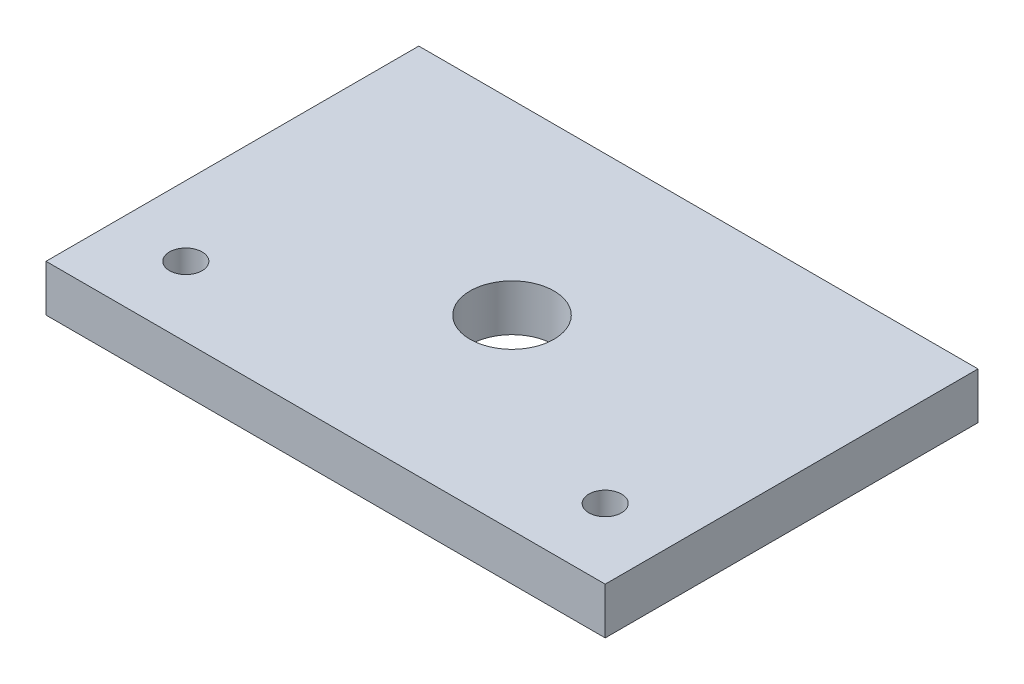
ISO-10303-21;
HEADER;
FILE_DESCRIPTION(('STEP AP214'),'2;1');
FILE_NAME('part.step','',(''),(''),'','','');
FILE_SCHEMA(('AUTOMOTIVE_DESIGN { 1 0 10303 214 1 1 1 1 }'));
ENDSEC;
DATA;
#1=APPLICATION_CONTEXT('core data for automotive mechanical design processes');
#2=APPLICATION_PROTOCOL_DEFINITION('international standard','automotive_design',2000,#1);
#3=PRODUCT_CONTEXT('',#1,'mechanical');
#4=PRODUCT('Part','Part','',(#3));
#5=PRODUCT_RELATED_PRODUCT_CATEGORY('part','',(#4));
#6=PRODUCT_DEFINITION_FORMATION('','',#4);
#7=PRODUCT_DEFINITION_CONTEXT('part definition',#1,'design');
#8=PRODUCT_DEFINITION('design','',#6,#7);
#9=PRODUCT_DEFINITION_SHAPE('','',#8);
#10=(LENGTH_UNIT() NAMED_UNIT(*) SI_UNIT(.MILLI.,.METRE.));
#11=(NAMED_UNIT(*) PLANE_ANGLE_UNIT() SI_UNIT($,.RADIAN.));
#12=(NAMED_UNIT(*) SI_UNIT($,.STERADIAN.) SOLID_ANGLE_UNIT());
#13=UNCERTAINTY_MEASURE_WITH_UNIT(LENGTH_MEASURE(1.E-05),#10,'distance_accuracy_value','');
#14=(GEOMETRIC_REPRESENTATION_CONTEXT(3) GLOBAL_UNCERTAINTY_ASSIGNED_CONTEXT((#13)) GLOBAL_UNIT_ASSIGNED_CONTEXT((#10,
#11,#12)) REPRESENTATION_CONTEXT('',''));
#15=CARTESIAN_POINT('',(0.,0.,0.));
#16=DIRECTION('',(0.,0.,1.));
#17=DIRECTION('',(1.,0.,0.));
#18=AXIS2_PLACEMENT_3D('',#15,#16,#17);
#19=CARTESIAN_POINT('',(0.,10.,0.));
#20=DIRECTION('',(0.,-1.,0.));
#21=DIRECTION('',(0.,0.,-1.));
#22=AXIS2_PLACEMENT_3D('',#19,#20,#21);
#23=PLANE('',#22);
#24=DIRECTION('',(0.,0.,-1.));
#25=VECTOR('',#24,1.);
#26=CARTESIAN_POINT('',(60.,10.,40.));
#27=LINE('',#26,#25);
#28=CARTESIAN_POINT('',(60.,10.,40.));
#29=VERTEX_POINT('',#28);
#30=CARTESIAN_POINT('',(60.,10.,-40.));
#31=VERTEX_POINT('',#30);
#32=EDGE_CURVE('E89',#29,#31,#27,.T.);
#33=ORIENTED_EDGE('',*,*,#32,.T.);
#34=DIRECTION('',(-1.,0.,0.));
#35=VECTOR('',#34,1.);
#36=CARTESIAN_POINT('',(-60.,10.,-40.));
#37=LINE('',#36,#35);
#38=CARTESIAN_POINT('',(-60.,10.,-40.));
#39=VERTEX_POINT('',#38);
#40=EDGE_CURVE('E84',#31,#39,#37,.T.);
#41=ORIENTED_EDGE('',*,*,#40,.T.);
#42=DIRECTION('',(0.,0.,1.));
#43=VECTOR('',#42,1.);
#44=CARTESIAN_POINT('',(-60.,10.,40.));
#45=LINE('',#44,#43);
#46=CARTESIAN_POINT('',(-60.,10.,40.));
#47=VERTEX_POINT('',#46);
#48=EDGE_CURVE('E87',#39,#47,#45,.T.);
#49=ORIENTED_EDGE('',*,*,#48,.T.);
#50=DIRECTION('',(1.,0.,0.));
#51=VECTOR('',#50,1.);
#52=CARTESIAN_POINT('',(-60.,10.,40.));
#53=LINE('',#52,#51);
#54=EDGE_CURVE('E54',#47,#29,#53,.T.);
#55=ORIENTED_EDGE('',*,*,#54,.T.);
#56=EDGE_LOOP('',(#33,#41,#49,#55));
#57=FACE_BOUND('',#56,.T.);
#58=CARTESIAN_POINT('',(0.,10.,0.));
#59=DIRECTION('',(0.,1.,0.));
#60=DIRECTION('',(0.,0.,1.));
#61=AXIS2_PLACEMENT_3D('',#58,#59,#60);
#62=CIRCLE('',#61,8.99999999999999);
#63=CARTESIAN_POINT('',(0.,10.,9.));
#64=VERTEX_POINT('',#63);
#65=EDGE_CURVE('E104',#64,#64,#62,.T.);
#66=ORIENTED_EDGE('',*,*,#65,.F.);
#67=EDGE_LOOP('',(#66));
#68=FACE_BOUND('',#67,.T.);
#69=CARTESIAN_POINT('',(-45.,10.,25.));
#70=DIRECTION('',(0.,1.,0.));
#71=DIRECTION('',(0.,0.,1.));
#72=AXIS2_PLACEMENT_3D('',#69,#70,#71);
#73=CIRCLE('',#72,3.5);
#74=CARTESIAN_POINT('',(-45.,10.,28.5));
#75=VERTEX_POINT('',#74);
#76=EDGE_CURVE('E119',#75,#75,#73,.T.);
#77=ORIENTED_EDGE('',*,*,#76,.F.);
#78=EDGE_LOOP('',(#77));
#79=FACE_BOUND('',#78,.T.);
#80=CARTESIAN_POINT('',(45.,10.,25.));
#81=DIRECTION('',(0.,1.,0.));
#82=DIRECTION('',(0.,0.,1.));
#83=AXIS2_PLACEMENT_3D('',#80,#81,#82);
#84=CIRCLE('',#83,3.5);
#85=CARTESIAN_POINT('',(45.,10.,28.5));
#86=VERTEX_POINT('',#85);
#87=EDGE_CURVE('E125',#86,#86,#84,.T.);
#88=ORIENTED_EDGE('',*,*,#87,.F.);
#89=EDGE_LOOP('',(#88));
#90=FACE_BOUND('',#89,.T.);
#91=ADVANCED_FACE('F37',(#57,#68,#79,#90),#23,.F.);
#92=CARTESIAN_POINT('',(0.,0.,0.));
#93=DIRECTION('',(0.,-1.,0.));
#94=DIRECTION('',(0.,0.,-1.));
#95=AXIS2_PLACEMENT_3D('',#92,#93,#94);
#96=PLANE('',#95);
#97=CARTESIAN_POINT('',(-45.,0.,25.));
#98=DIRECTION('',(0.,1.,0.));
#99=DIRECTION('',(0.,0.,1.));
#100=AXIS2_PLACEMENT_3D('',#97,#98,#99);
#101=CIRCLE('',#100,3.5);
#102=CARTESIAN_POINT('',(-45.,0.,28.5));
#103=VERTEX_POINT('',#102);
#104=EDGE_CURVE('E122',#103,#103,#101,.T.);
#105=ORIENTED_EDGE('',*,*,#104,.T.);
#106=EDGE_LOOP('',(#105));
#107=FACE_BOUND('',#106,.T.);
#108=DIRECTION('',(0.,0.,-1.));
#109=VECTOR('',#108,1.);
#110=CARTESIAN_POINT('',(60.,0.,40.));
#111=LINE('',#110,#109);
#112=CARTESIAN_POINT('',(60.,0.,40.));
#113=VERTEX_POINT('',#112);
#114=CARTESIAN_POINT('',(60.,0.,-40.));
#115=VERTEX_POINT('',#114);
#116=EDGE_CURVE('E101',#113,#115,#111,.T.);
#117=ORIENTED_EDGE('',*,*,#116,.F.);
#118=DIRECTION('',(1.,0.,0.));
#119=VECTOR('',#118,1.);
#120=CARTESIAN_POINT('',(-60.,0.,40.));
#121=LINE('',#120,#119);
#122=CARTESIAN_POINT('',(-60.,0.,40.));
#123=VERTEX_POINT('',#122);
#124=EDGE_CURVE('E77',#123,#113,#121,.T.);
#125=ORIENTED_EDGE('',*,*,#124,.F.);
#126=DIRECTION('',(0.,0.,1.));
#127=VECTOR('',#126,1.);
#128=CARTESIAN_POINT('',(-60.,0.,40.));
#129=LINE('',#128,#127);
#130=CARTESIAN_POINT('',(-60.,0.,-40.));
#131=VERTEX_POINT('',#130);
#132=EDGE_CURVE('E71',#131,#123,#129,.T.);
#133=ORIENTED_EDGE('',*,*,#132,.F.);
#134=DIRECTION('',(-1.,0.,0.));
#135=VECTOR('',#134,1.);
#136=CARTESIAN_POINT('',(-60.,0.,-40.));
#137=LINE('',#136,#135);
#138=EDGE_CURVE('E93',#115,#131,#137,.T.);
#139=ORIENTED_EDGE('',*,*,#138,.F.);
#140=EDGE_LOOP('',(#117,#125,#133,#139));
#141=FACE_BOUND('',#140,.T.);
#142=CARTESIAN_POINT('',(0.,0.,0.));
#143=DIRECTION('',(0.,1.,0.));
#144=DIRECTION('',(0.,0.,1.));
#145=AXIS2_PLACEMENT_3D('',#142,#143,#144);
#146=CIRCLE('',#145,8.99999999999999);
#147=CARTESIAN_POINT('',(0.,0.,9.));
#148=VERTEX_POINT('',#147);
#149=EDGE_CURVE('E116',#148,#148,#146,.T.);
#150=ORIENTED_EDGE('',*,*,#149,.T.);
#151=EDGE_LOOP('',(#150));
#152=FACE_BOUND('',#151,.T.);
#153=CARTESIAN_POINT('',(45.,0.,25.));
#154=DIRECTION('',(0.,1.,0.));
#155=DIRECTION('',(0.,0.,1.));
#156=AXIS2_PLACEMENT_3D('',#153,#154,#155);
#157=CIRCLE('',#156,3.5);
#158=CARTESIAN_POINT('',(45.,0.,28.5));
#159=VERTEX_POINT('',#158);
#160=EDGE_CURVE('E128',#159,#159,#157,.T.);
#161=ORIENTED_EDGE('',*,*,#160,.T.);
#162=EDGE_LOOP('',(#161));
#163=FACE_BOUND('',#162,.T.);
#164=ADVANCED_FACE('F112',(#107,#141,#152,#163),#96,.T.);
#165=CARTESIAN_POINT('',(60.,10.,40.));
#166=DIRECTION('',(-1.,0.,0.));
#167=DIRECTION('',(0.,0.,1.));
#168=AXIS2_PLACEMENT_3D('',#165,#166,#167);
#169=PLANE('',#168);
#170=ORIENTED_EDGE('',*,*,#116,.T.);
#171=DIRECTION('',(0.,-1.,0.));
#172=VECTOR('',#171,1.);
#173=CARTESIAN_POINT('',(60.,10.,-40.));
#174=LINE('',#173,#172);
#175=EDGE_CURVE('E11',#31,#115,#174,.T.);
#176=ORIENTED_EDGE('',*,*,#175,.F.);
#177=ORIENTED_EDGE('',*,*,#32,.F.);
#178=DIRECTION('',(0.,-1.,0.));
#179=VECTOR('',#178,1.);
#180=CARTESIAN_POINT('',(60.,10.,40.));
#181=LINE('',#180,#179);
#182=EDGE_CURVE('E97',#29,#113,#181,.T.);
#183=ORIENTED_EDGE('',*,*,#182,.T.);
#184=EDGE_LOOP('',(#170,#176,#177,#183));
#185=FACE_BOUND('',#184,.T.);
#186=ADVANCED_FACE('F39',(#185),#169,.F.);
#187=CARTESIAN_POINT('',(-60.,10.,-40.));
#188=DIRECTION('',(0.,0.,1.));
#189=DIRECTION('',(1.,0.,0.));
#190=AXIS2_PLACEMENT_3D('',#187,#188,#189);
#191=PLANE('',#190);
#192=ORIENTED_EDGE('',*,*,#138,.T.);
#193=DIRECTION('',(0.,-1.,0.));
#194=VECTOR('',#193,1.);
#195=CARTESIAN_POINT('',(-60.,10.,-40.));
#196=LINE('',#195,#194);
#197=EDGE_CURVE('E46',#39,#131,#196,.T.);
#198=ORIENTED_EDGE('',*,*,#197,.F.);
#199=ORIENTED_EDGE('',*,*,#40,.F.);
#200=ORIENTED_EDGE('',*,*,#175,.T.);
#201=EDGE_LOOP('',(#192,#198,#199,#200));
#202=FACE_BOUND('',#201,.T.);
#203=ADVANCED_FACE('F92',(#202),#191,.F.);
#204=CARTESIAN_POINT('',(-60.,10.,40.));
#205=DIRECTION('',(1.,0.,0.));
#206=DIRECTION('',(0.,0.,-1.));
#207=AXIS2_PLACEMENT_3D('',#204,#205,#206);
#208=PLANE('',#207);
#209=ORIENTED_EDGE('',*,*,#132,.T.);
#210=DIRECTION('',(0.,-1.,0.));
#211=VECTOR('',#210,1.);
#212=CARTESIAN_POINT('',(-60.,10.,40.));
#213=LINE('',#212,#211);
#214=EDGE_CURVE('E94',#47,#123,#213,.T.);
#215=ORIENTED_EDGE('',*,*,#214,.F.);
#216=ORIENTED_EDGE('',*,*,#48,.F.);
#217=ORIENTED_EDGE('',*,*,#197,.T.);
#218=EDGE_LOOP('',(#209,#215,#216,#217));
#219=FACE_BOUND('',#218,.T.);
#220=ADVANCED_FACE('F95',(#219),#208,.F.);
#221=CARTESIAN_POINT('',(-60.,10.,40.));
#222=DIRECTION('',(0.,0.,-1.));
#223=DIRECTION('',(-1.,0.,0.));
#224=AXIS2_PLACEMENT_3D('',#221,#222,#223);
#225=PLANE('',#224);
#226=ORIENTED_EDGE('',*,*,#124,.T.);
#227=ORIENTED_EDGE('',*,*,#182,.F.);
#228=ORIENTED_EDGE('',*,*,#54,.F.);
#229=ORIENTED_EDGE('',*,*,#214,.T.);
#230=EDGE_LOOP('',(#226,#227,#228,#229));
#231=FACE_BOUND('',#230,.T.);
#232=ADVANCED_FACE('F109',(#231),#225,.F.);
#233=CARTESIAN_POINT('',(0.,10.,0.));
#234=DIRECTION('',(0.,-1.,0.));
#235=DIRECTION('',(0.,0.,-1.));
#236=AXIS2_PLACEMENT_3D('',#233,#234,#235);
#237=CYLINDRICAL_SURFACE('',#236,8.99999999999999);
#238=ORIENTED_EDGE('',*,*,#65,.T.);
#239=EDGE_LOOP('',(#238));
#240=FACE_BOUND('',#239,.T.);
#241=ORIENTED_EDGE('',*,*,#149,.F.);
#242=EDGE_LOOP('',(#241));
#243=FACE_BOUND('',#242,.T.);
#244=ADVANCED_FACE('F145',(#240,#243),#237,.F.);
#245=CARTESIAN_POINT('',(-45.,10.,25.));
#246=DIRECTION('',(0.,-1.,0.));
#247=DIRECTION('',(0.,0.,-1.));
#248=AXIS2_PLACEMENT_3D('',#245,#246,#247);
#249=CYLINDRICAL_SURFACE('',#248,3.5);
#250=ORIENTED_EDGE('',*,*,#76,.T.);
#251=EDGE_LOOP('',(#250));
#252=FACE_BOUND('',#251,.T.);
#253=ORIENTED_EDGE('',*,*,#104,.F.);
#254=EDGE_LOOP('',(#253));
#255=FACE_BOUND('',#254,.T.);
#256=ADVANCED_FACE('F199',(#252,#255),#249,.F.);
#257=CARTESIAN_POINT('',(45.,10.,25.));
#258=DIRECTION('',(0.,-1.,0.));
#259=DIRECTION('',(0.,0.,-1.));
#260=AXIS2_PLACEMENT_3D('',#257,#258,#259);
#261=CYLINDRICAL_SURFACE('',#260,3.5);
#262=ORIENTED_EDGE('',*,*,#87,.T.);
#263=EDGE_LOOP('',(#262));
#264=FACE_BOUND('',#263,.T.);
#265=ORIENTED_EDGE('',*,*,#160,.F.);
#266=EDGE_LOOP('',(#265));
#267=FACE_BOUND('',#266,.T.);
#268=ADVANCED_FACE('F134',(#264,#267),#261,.F.);
#269=CLOSED_SHELL('',(#91,#164,#186,#203,#220,#232,#244,#256,#268));
#270=MANIFOLD_SOLID_BREP('B2',#269);
#271=ADVANCED_BREP_SHAPE_REPRESENTATION('',(#18,#270),#14);
#272=SHAPE_DEFINITION_REPRESENTATION(#9,#271);
ENDSEC;
END-ISO-10303-21;
